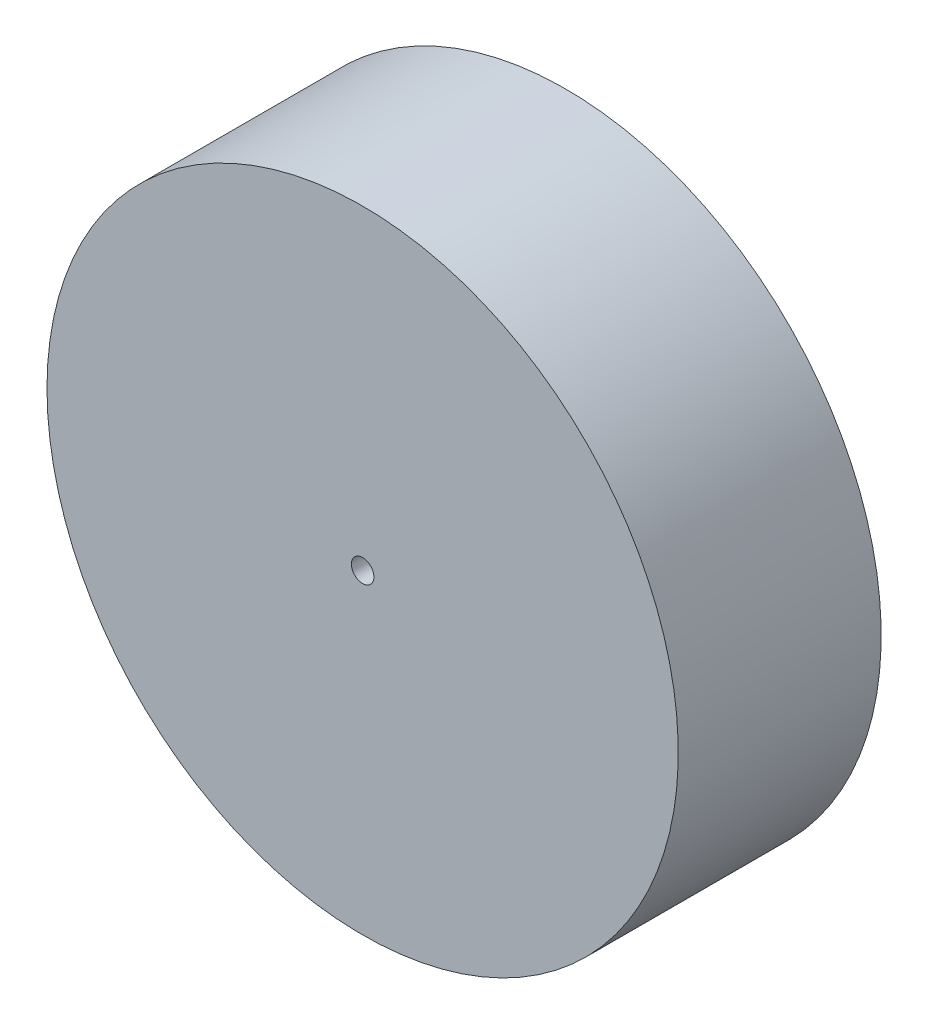
ISO-10303-21;
HEADER;
FILE_DESCRIPTION(('STEP AP214'),'2;1');
FILE_NAME('part.step','',(''),(''),'','','');
FILE_SCHEMA(('AUTOMOTIVE_DESIGN { 1 0 10303 214 1 1 1 1 }'));
ENDSEC;
DATA;
#1=APPLICATION_CONTEXT('core data for automotive mechanical design processes');
#2=APPLICATION_PROTOCOL_DEFINITION('international standard','automotive_design',2000,#1);
#3=PRODUCT_CONTEXT('',#1,'mechanical');
#4=PRODUCT('Part','Part','',(#3));
#5=PRODUCT_RELATED_PRODUCT_CATEGORY('part','',(#4));
#6=PRODUCT_DEFINITION_FORMATION('','',#4);
#7=PRODUCT_DEFINITION_CONTEXT('part definition',#1,'design');
#8=PRODUCT_DEFINITION('design','',#6,#7);
#9=PRODUCT_DEFINITION_SHAPE('','',#8);
#10=(LENGTH_UNIT() NAMED_UNIT(*) SI_UNIT(.MILLI.,.METRE.));
#11=(NAMED_UNIT(*) PLANE_ANGLE_UNIT() SI_UNIT($,.RADIAN.));
#12=(NAMED_UNIT(*) SI_UNIT($,.STERADIAN.) SOLID_ANGLE_UNIT());
#13=UNCERTAINTY_MEASURE_WITH_UNIT(LENGTH_MEASURE(1.E-05),#10,'distance_accuracy_value','');
#14=(GEOMETRIC_REPRESENTATION_CONTEXT(3) GLOBAL_UNCERTAINTY_ASSIGNED_CONTEXT((#13)) GLOBAL_UNIT_ASSIGNED_CONTEXT((#10,
#11,#12)) REPRESENTATION_CONTEXT('',''));
#15=CARTESIAN_POINT('',(0.,0.,0.));
#16=DIRECTION('',(0.,0.,1.));
#17=DIRECTION('',(1.,0.,0.));
#18=AXIS2_PLACEMENT_3D('',#15,#16,#17);
#19=CARTESIAN_POINT('',(0.,0.,45.));
#20=DIRECTION('',(0.,0.,-1.));
#21=DIRECTION('',(-1.,0.,0.));
#22=AXIS2_PLACEMENT_3D('',#19,#20,#21);
#23=CYLINDRICAL_SURFACE('',#22,70.);
#24=CARTESIAN_POINT('',(0.,0.,45.));
#25=DIRECTION('',(0.,0.,1.));
#26=DIRECTION('',(1.,0.,0.));
#27=AXIS2_PLACEMENT_3D('',#24,#25,#26);
#28=CIRCLE('',#27,70.);
#29=CARTESIAN_POINT('',(-70.,0.,45.));
#30=VERTEX_POINT('',#29);
#31=EDGE_CURVE('E10',#30,#30,#28,.T.);
#32=CARTESIAN_POINT('',(0.,0.,0.));
#33=DIRECTION('',(0.,0.,1.));
#34=DIRECTION('',(1.,0.,0.));
#35=AXIS2_PLACEMENT_3D('',#32,#33,#34);
#36=CIRCLE('',#35,70.);
#37=CARTESIAN_POINT('',(-70.,0.,0.));
#38=VERTEX_POINT('',#37);
#39=EDGE_CURVE('E45',#38,#38,#36,.T.);
#40=CARTESIAN_POINT('',(-70.,0.,45.));
#41=CARTESIAN_POINT('',(-70.,0.,44.53125));
#42=CARTESIAN_POINT('',(-70.,0.,44.0625));
#43=CARTESIAN_POINT('',(-70.,0.,43.125));
#44=CARTESIAN_POINT('',(-70.,0.,42.65625));
#45=CARTESIAN_POINT('',(-70.,0.,41.71875));
#46=CARTESIAN_POINT('',(-70.,0.,41.25));
#47=CARTESIAN_POINT('',(-70.,0.,40.3125));
#48=CARTESIAN_POINT('',(-70.,0.,39.84375));
#49=CARTESIAN_POINT('',(-70.,0.,38.90625));
#50=CARTESIAN_POINT('',(-70.,0.,38.4375));
#51=CARTESIAN_POINT('',(-70.,0.,37.5));
#52=CARTESIAN_POINT('',(-70.,0.,37.03125));
#53=CARTESIAN_POINT('',(-70.,0.,36.09375));
#54=CARTESIAN_POINT('',(-70.,0.,35.625));
#55=CARTESIAN_POINT('',(-70.,0.,34.6875));
#56=CARTESIAN_POINT('',(-70.,0.,34.21875));
#57=CARTESIAN_POINT('',(-70.,0.,33.28125));
#58=CARTESIAN_POINT('',(-70.,0.,32.8125));
#59=CARTESIAN_POINT('',(-70.,0.,31.875));
#60=CARTESIAN_POINT('',(-70.,0.,31.40625));
#61=CARTESIAN_POINT('',(-70.,0.,30.46875));
#62=CARTESIAN_POINT('',(-70.,0.,30.));
#63=CARTESIAN_POINT('',(-70.,0.,29.0625));
#64=CARTESIAN_POINT('',(-70.,0.,28.59375));
#65=CARTESIAN_POINT('',(-70.,0.,27.65625));
#66=CARTESIAN_POINT('',(-70.,0.,27.1875));
#67=CARTESIAN_POINT('',(-70.,0.,26.25));
#68=CARTESIAN_POINT('',(-70.,0.,25.78125));
#69=CARTESIAN_POINT('',(-70.,0.,24.84375));
#70=CARTESIAN_POINT('',(-70.,0.,24.375));
#71=CARTESIAN_POINT('',(-70.,0.,23.4375));
#72=CARTESIAN_POINT('',(-70.,0.,22.96875));
#73=CARTESIAN_POINT('',(-70.,0.,22.03125));
#74=CARTESIAN_POINT('',(-70.,0.,21.5625));
#75=CARTESIAN_POINT('',(-70.,0.,20.625));
#76=CARTESIAN_POINT('',(-70.,0.,20.15625));
#77=CARTESIAN_POINT('',(-70.,0.,19.21875));
#78=CARTESIAN_POINT('',(-70.,0.,18.75));
#79=CARTESIAN_POINT('',(-70.,0.,17.8125));
#80=CARTESIAN_POINT('',(-70.,0.,17.34375));
#81=CARTESIAN_POINT('',(-70.,0.,16.40625));
#82=CARTESIAN_POINT('',(-70.,0.,15.9375));
#83=CARTESIAN_POINT('',(-70.,0.,15.));
#84=CARTESIAN_POINT('',(-70.,0.,14.53125));
#85=CARTESIAN_POINT('',(-70.,0.,13.59375));
#86=CARTESIAN_POINT('',(-70.,0.,13.125));
#87=CARTESIAN_POINT('',(-70.,0.,12.1875));
#88=CARTESIAN_POINT('',(-70.,0.,11.71875));
#89=CARTESIAN_POINT('',(-70.,0.,10.78125));
#90=CARTESIAN_POINT('',(-70.,0.,10.3125));
#91=CARTESIAN_POINT('',(-70.,0.,9.37499999999999));
#92=CARTESIAN_POINT('',(-70.,0.,8.90624999999999));
#93=CARTESIAN_POINT('',(-70.,0.,7.96874999999999));
#94=CARTESIAN_POINT('',(-70.,0.,7.5));
#95=CARTESIAN_POINT('',(-70.,0.,6.56249999999999));
#96=CARTESIAN_POINT('',(-70.,0.,6.09374999999999));
#97=CARTESIAN_POINT('',(-70.,0.,5.15624999999999));
#98=CARTESIAN_POINT('',(-70.,0.,4.68749999999999));
#99=CARTESIAN_POINT('',(-70.,0.,3.74999999999999));
#100=CARTESIAN_POINT('',(-70.,0.,3.28124999999999));
#101=CARTESIAN_POINT('',(-70.,0.,2.34374999999999));
#102=CARTESIAN_POINT('',(-70.,0.,1.87499999999999));
#103=CARTESIAN_POINT('',(-70.,0.,0.937499999999992));
#104=CARTESIAN_POINT('',(-70.,0.,0.468749999999993));
#105=CARTESIAN_POINT('',(-70.,0.,0.));
#106=B_SPLINE_CURVE_WITH_KNOTS('',3,(#40,#41,#42,#43,#44,#45,#46,#47,#48,#49,#50,#51,#52,#53,
#54,#55,#56,#57,#58,#59,#60,#61,#62,#63,#64,#65,#66,#67,#68,#69,#70,#71,#72,#73,#74,#75,#76,#77,
#78,#79,#80,#81,#82,#83,#84,#85,#86,#87,#88,#89,#90,#91,#92,#93,#94,#95,#96,#97,#98,#99,#100,
#101,#102,#103,#104,#105),.UNSPECIFIED.,.F.,.F.,(4,2,2,2,2,2,2,2,2,2,2,2,2,2,2,2,2,2,2,2,2,2,2,
2,2,2,2,2,2,2,2,2,4),(0.,1.40625,2.8125,4.21874999999999,5.625,7.03125,8.43749999999999,9.84375,
11.25,12.65625,14.0625,15.46875,16.875,18.28125,19.6875,21.09375,22.5,23.90625,25.3125,26.71875,
28.125,29.53125,30.9375,32.34375,33.75,35.15625,36.5625,37.96875,39.375,40.78125,42.1875,
43.59375,45.),.UNSPECIFIED.);
#107=EDGE_CURVE('BSEAM37',#30,#38,#106,.T.);
#108=ORIENTED_EDGE('',*,*,#31,.F.);
#109=ORIENTED_EDGE('',*,*,#39,.T.);
#110=ORIENTED_EDGE('',*,*,#107,.T.);
#111=ORIENTED_EDGE('',*,*,#107,.F.);
#112=EDGE_LOOP('',(#108,#110,#109,#111));
#113=FACE_BOUND('',#112,.T.);
#114=ADVANCED_FACE('F37',(#113),#23,.T.);
#115=CARTESIAN_POINT('',(0.,0.,45.));
#116=DIRECTION('',(0.,0.,1.));
#117=DIRECTION('',(1.,0.,0.));
#118=AXIS2_PLACEMENT_3D('',#115,#116,#117);
#119=PLANE('',#118);
#120=CARTESIAN_POINT('',(0.,0.,45.));
#121=DIRECTION('',(0.,0.,1.));
#122=DIRECTION('',(1.,0.,0.));
#123=AXIS2_PLACEMENT_3D('',#120,#121,#122);
#124=CIRCLE('',#123,2.5);
#125=CARTESIAN_POINT('',(-2.5,0.,45.));
#126=VERTEX_POINT('',#125);
#127=EDGE_CURVE('E40',#126,#126,#124,.F.);
#128=ORIENTED_EDGE('',*,*,#127,.T.);
#129=EDGE_LOOP('',(#128));
#130=FACE_BOUND('',#129,.T.);
#131=ORIENTED_EDGE('',*,*,#31,.T.);
#132=EDGE_LOOP('',(#131));
#133=FACE_BOUND('',#132,.T.);
#134=ADVANCED_FACE('F61',(#130,#133),#119,.T.);
#135=CARTESIAN_POINT('',(0.,0.,0.));
#136=DIRECTION('',(0.,0.,1.));
#137=DIRECTION('',(1.,0.,0.));
#138=AXIS2_PLACEMENT_3D('',#135,#136,#137);
#139=PLANE('',#138);
#140=ORIENTED_EDGE('',*,*,#39,.F.);
#141=EDGE_LOOP('',(#140));
#142=FACE_BOUND('',#141,.T.);
#143=ADVANCED_FACE('F67',(#142),#139,.F.);
#144=CARTESIAN_POINT('',(0.,0.,45.000012));
#145=DIRECTION('',(0.,0.,-1.));
#146=DIRECTION('',(-1.,0.,0.));
#147=AXIS2_PLACEMENT_3D('',#144,#145,#146);
#148=CYLINDRICAL_SURFACE('',#147,2.5);
#149=CARTESIAN_POINT('',(0.,0.,25.));
#150=DIRECTION('',(0.,0.,1.));
#151=DIRECTION('',(1.,0.,0.));
#152=AXIS2_PLACEMENT_3D('',#149,#150,#151);
#153=CIRCLE('',#152,2.5);
#154=CARTESIAN_POINT('',(-2.5,0.,25.));
#155=VERTEX_POINT('',#154);
#156=EDGE_CURVE('E52',#155,#155,#153,.T.);
#157=CARTESIAN_POINT('',(-2.5,0.,45.));
#158=CARTESIAN_POINT('',(-2.5,0.,44.7916666666667));
#159=CARTESIAN_POINT('',(-2.5,0.,44.5833333333333));
#160=CARTESIAN_POINT('',(-2.5,0.,44.1666666666667));
#161=CARTESIAN_POINT('',(-2.5,0.,43.9583333333333));
#162=CARTESIAN_POINT('',(-2.5,0.,43.5416666666667));
#163=CARTESIAN_POINT('',(-2.5,0.,43.3333333333333));
#164=CARTESIAN_POINT('',(-2.5,0.,42.9166666666667));
#165=CARTESIAN_POINT('',(-2.5,0.,42.7083333333333));
#166=CARTESIAN_POINT('',(-2.5,0.,42.2916666666667));
#167=CARTESIAN_POINT('',(-2.5,0.,42.0833333333333));
#168=CARTESIAN_POINT('',(-2.5,0.,41.6666666666667));
#169=CARTESIAN_POINT('',(-2.5,0.,41.4583333333333));
#170=CARTESIAN_POINT('',(-2.5,0.,41.0416666666667));
#171=CARTESIAN_POINT('',(-2.5,0.,40.8333333333333));
#172=CARTESIAN_POINT('',(-2.5,0.,40.4166666666667));
#173=CARTESIAN_POINT('',(-2.5,0.,40.2083333333333));
#174=CARTESIAN_POINT('',(-2.5,0.,39.7916666666667));
#175=CARTESIAN_POINT('',(-2.5,0.,39.5833333333333));
#176=CARTESIAN_POINT('',(-2.5,0.,39.1666666666667));
#177=CARTESIAN_POINT('',(-2.5,0.,38.9583333333333));
#178=CARTESIAN_POINT('',(-2.5,0.,38.5416666666667));
#179=CARTESIAN_POINT('',(-2.5,0.,38.3333333333333));
#180=CARTESIAN_POINT('',(-2.5,0.,37.9166666666667));
#181=CARTESIAN_POINT('',(-2.5,0.,37.7083333333333));
#182=CARTESIAN_POINT('',(-2.5,0.,37.2916666666667));
#183=CARTESIAN_POINT('',(-2.5,0.,37.0833333333333));
#184=CARTESIAN_POINT('',(-2.5,0.,36.6666666666667));
#185=CARTESIAN_POINT('',(-2.5,0.,36.4583333333333));
#186=CARTESIAN_POINT('',(-2.5,0.,36.0416666666667));
#187=CARTESIAN_POINT('',(-2.5,0.,35.8333333333333));
#188=CARTESIAN_POINT('',(-2.5,0.,35.4166666666667));
#189=CARTESIAN_POINT('',(-2.5,0.,35.2083333333333));
#190=CARTESIAN_POINT('',(-2.5,0.,34.7916666666667));
#191=CARTESIAN_POINT('',(-2.5,0.,34.5833333333333));
#192=CARTESIAN_POINT('',(-2.5,0.,34.1666666666667));
#193=CARTESIAN_POINT('',(-2.5,0.,33.9583333333333));
#194=CARTESIAN_POINT('',(-2.5,0.,33.5416666666667));
#195=CARTESIAN_POINT('',(-2.5,0.,33.3333333333333));
#196=CARTESIAN_POINT('',(-2.5,0.,32.9166666666667));
#197=CARTESIAN_POINT('',(-2.5,0.,32.7083333333333));
#198=CARTESIAN_POINT('',(-2.5,0.,32.2916666666667));
#199=CARTESIAN_POINT('',(-2.5,0.,32.0833333333333));
#200=CARTESIAN_POINT('',(-2.5,0.,31.6666666666667));
#201=CARTESIAN_POINT('',(-2.5,0.,31.4583333333333));
#202=CARTESIAN_POINT('',(-2.5,0.,31.0416666666667));
#203=CARTESIAN_POINT('',(-2.5,0.,30.8333333333333));
#204=CARTESIAN_POINT('',(-2.5,0.,30.4166666666667));
#205=CARTESIAN_POINT('',(-2.5,0.,30.2083333333333));
#206=CARTESIAN_POINT('',(-2.5,0.,29.7916666666667));
#207=CARTESIAN_POINT('',(-2.5,0.,29.5833333333333));
#208=CARTESIAN_POINT('',(-2.5,0.,29.1666666666667));
#209=CARTESIAN_POINT('',(-2.5,0.,28.9583333333333));
#210=CARTESIAN_POINT('',(-2.5,0.,28.5416666666667));
#211=CARTESIAN_POINT('',(-2.5,0.,28.3333333333333));
#212=CARTESIAN_POINT('',(-2.5,0.,27.9166666666667));
#213=CARTESIAN_POINT('',(-2.5,0.,27.7083333333333));
#214=CARTESIAN_POINT('',(-2.5,0.,27.2916666666667));
#215=CARTESIAN_POINT('',(-2.5,0.,27.0833333333333));
#216=CARTESIAN_POINT('',(-2.5,0.,26.6666666666667));
#217=CARTESIAN_POINT('',(-2.5,0.,26.4583333333333));
#218=CARTESIAN_POINT('',(-2.5,0.,26.0416666666667));
#219=CARTESIAN_POINT('',(-2.5,0.,25.8333333333333));
#220=CARTESIAN_POINT('',(-2.5,0.,25.4166666666667));
#221=CARTESIAN_POINT('',(-2.5,0.,25.2083333333333));
#222=CARTESIAN_POINT('',(-2.5,0.,25.));
#223=B_SPLINE_CURVE_WITH_KNOTS('',3,(#157,#158,#159,#160,#161,#162,#163,#164,#165,#166,#167,
#168,#169,#170,#171,#172,#173,#174,#175,#176,#177,#178,#179,#180,#181,#182,#183,#184,#185,#186,
#187,#188,#189,#190,#191,#192,#193,#194,#195,#196,#197,#198,#199,#200,#201,#202,#203,#204,#205,
#206,#207,#208,#209,#210,#211,#212,#213,#214,#215,#216,#217,#218,#219,#220,#221,#222),
.UNSPECIFIED.,.F.,.F.,(4,2,2,2,2,2,2,2,2,2,2,2,2,2,2,2,2,2,2,2,2,2,2,2,2,2,2,2,2,2,2,2,4),(0.,
0.624999999999994,1.24999999999999,1.87499999999999,2.5,3.125,3.75,4.375,5.,5.625,6.25,6.875,
7.49999999999999,8.12499999999999,8.74999999999999,9.37499999999999,9.99999999999999,10.625,
11.25,11.875,12.5,13.125,13.75,14.375,15.,15.625,16.25,16.875,17.5,18.125,18.75,19.375,20.),.UNSPECIFIED.);
#224=EDGE_CURVE('BSEAM63',#126,#155,#223,.T.);
#225=ORIENTED_EDGE('',*,*,#127,.F.);
#226=ORIENTED_EDGE('',*,*,#156,.F.);
#227=ORIENTED_EDGE('',*,*,#224,.T.);
#228=ORIENTED_EDGE('',*,*,#224,.F.);
#229=EDGE_LOOP('',(#225,#227,#226,#228));
#230=FACE_BOUND('',#229,.T.);
#231=ADVANCED_FACE('F63',(#230),#148,.F.);
#232=CARTESIAN_POINT('',(0.,0.,25.));
#233=DIRECTION('',(0.,0.,1.));
#234=DIRECTION('',(1.,0.,0.));
#235=AXIS2_PLACEMENT_3D('',#232,#233,#234);
#236=PLANE('',#235);
#237=ORIENTED_EDGE('',*,*,#156,.T.);
#238=EDGE_LOOP('',(#237));
#239=FACE_BOUND('',#238,.T.);
#240=ADVANCED_FACE('F66',(#239),#236,.T.);
#241=CLOSED_SHELL('',(#114,#134,#143,#231,#240));
#242=MANIFOLD_SOLID_BREP('B2',#241);
#243=ADVANCED_BREP_SHAPE_REPRESENTATION('',(#18,#242),#14);
#244=SHAPE_DEFINITION_REPRESENTATION(#9,#243);
ENDSEC;
END-ISO-10303-21;
